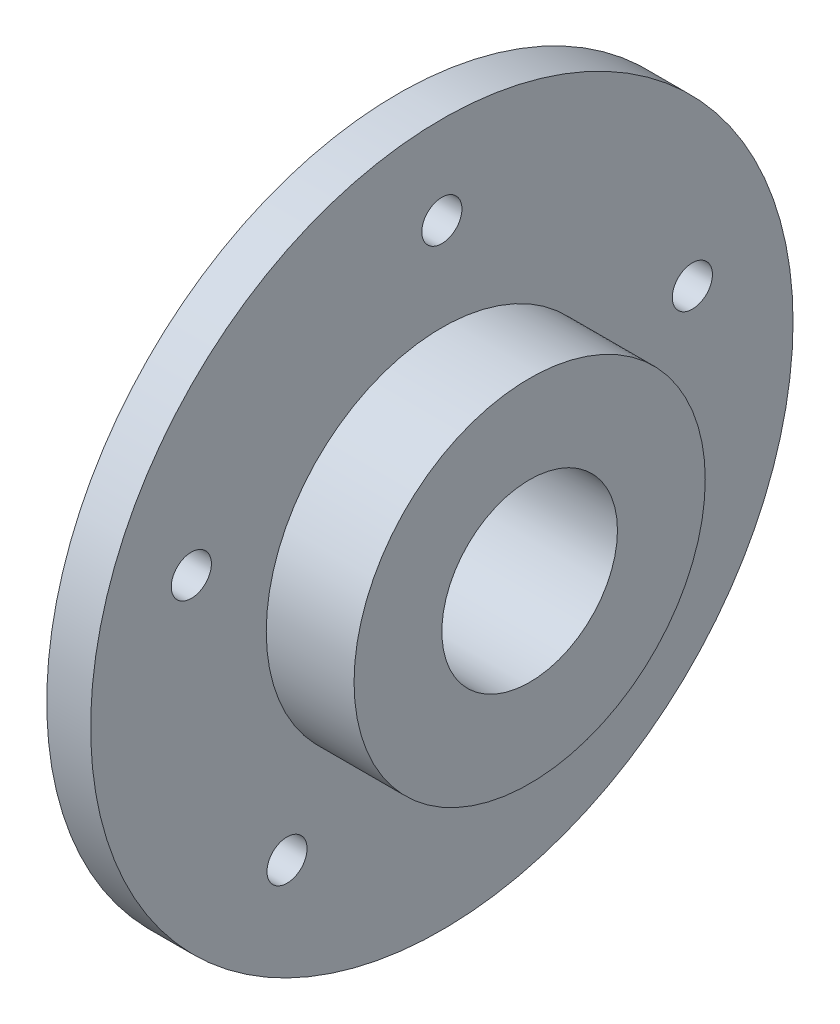
ISO-10303-21;
HEADER;
FILE_DESCRIPTION(('STEP AP214'),'2;1');
FILE_NAME('part.step','',(''),(''),'','','');
FILE_SCHEMA(('AUTOMOTIVE_DESIGN { 1 0 10303 214 1 1 1 1 }'));
ENDSEC;
DATA;
#1=APPLICATION_CONTEXT('core data for automotive mechanical design processes');
#2=APPLICATION_PROTOCOL_DEFINITION('international standard','automotive_design',2000,#1);
#3=PRODUCT_CONTEXT('',#1,'mechanical');
#4=PRODUCT('Part','Part','',(#3));
#5=PRODUCT_RELATED_PRODUCT_CATEGORY('part','',(#4));
#6=PRODUCT_DEFINITION_FORMATION('','',#4);
#7=PRODUCT_DEFINITION_CONTEXT('part definition',#1,'design');
#8=PRODUCT_DEFINITION('design','',#6,#7);
#9=PRODUCT_DEFINITION_SHAPE('','',#8);
#10=(LENGTH_UNIT() NAMED_UNIT(*) SI_UNIT(.MILLI.,.METRE.));
#11=(NAMED_UNIT(*) PLANE_ANGLE_UNIT() SI_UNIT($,.RADIAN.));
#12=(NAMED_UNIT(*) SI_UNIT($,.STERADIAN.) SOLID_ANGLE_UNIT());
#13=UNCERTAINTY_MEASURE_WITH_UNIT(LENGTH_MEASURE(1.E-05),#10,'distance_accuracy_value','');
#14=(GEOMETRIC_REPRESENTATION_CONTEXT(3) GLOBAL_UNCERTAINTY_ASSIGNED_CONTEXT((#13)) GLOBAL_UNIT_ASSIGNED_CONTEXT((#10,
#11,#12)) REPRESENTATION_CONTEXT('',''));
#15=CARTESIAN_POINT('',(0.,0.,0.));
#16=DIRECTION('',(0.,0.,1.));
#17=DIRECTION('',(1.,0.,0.));
#18=AXIS2_PLACEMENT_3D('',#15,#16,#17);
#19=CARTESIAN_POINT('',(6.35,0.711302035018839,0.));
#20=DIRECTION('',(1.,0.,0.));
#21=DIRECTION('',(0.,0.,-1.));
#22=AXIS2_PLACEMENT_3D('',#19,#20,#21);
#23=PLANE('',#22);
#24=CARTESIAN_POINT('',(6.35,0.,0.));
#25=DIRECTION('',(1.,0.,0.));
#26=DIRECTION('',(0.,0.,-1.));
#27=AXIS2_PLACEMENT_3D('',#24,#25,#26);
#28=CIRCLE('',#27,25.4);
#29=CARTESIAN_POINT('',(6.35,0.,-25.4));
#30=VERTEX_POINT('',#29);
#31=EDGE_CURVE('E10',#30,#30,#28,.T.);
#32=ORIENTED_EDGE('',*,*,#31,.F.);
#33=EDGE_LOOP('',(#32));
#34=FACE_BOUND('',#33,.T.);
#35=CARTESIAN_POINT('',(6.35,12.4848495207045,-36.2352532708453));
#36=DIRECTION('',(1.,0.,0.));
#37=DIRECTION('',(0.,0.,-1.));
#38=AXIS2_PLACEMENT_3D('',#35,#36,#37);
#39=CIRCLE('',#38,2.9);
#40=CARTESIAN_POINT('',(6.35,12.4848495207045,-39.1352532708453));
#41=VERTEX_POINT('',#40);
#42=EDGE_CURVE('E65',#41,#41,#39,.T.);
#43=ORIENTED_EDGE('',*,*,#42,.F.);
#44=EDGE_LOOP('',(#43));
#45=FACE_BOUND('',#44,.T.);
#46=CARTESIAN_POINT('',(6.35,-30.1122454506667,22.3946181123432));
#47=DIRECTION('',(1.,0.,0.));
#48=DIRECTION('',(0.,0.,-1.));
#49=AXIS2_PLACEMENT_3D('',#46,#47,#48);
#50=CIRCLE('',#49,2.9);
#51=CARTESIAN_POINT('',(6.35,-30.1122454506667,19.4946181123432));
#52=VERTEX_POINT('',#51);
#53=EDGE_CURVE('E81',#52,#52,#50,.T.);
#54=ORIENTED_EDGE('',*,*,#53,.F.);
#55=EDGE_LOOP('',(#54));
#56=FACE_BOUND('',#55,.T.);
#57=CARTESIAN_POINT('',(6.35,0.711302035018839,0.));
#58=DIRECTION('',(1.,0.,0.));
#59=DIRECTION('',(0.,0.,-1.));
#60=AXIS2_PLACEMENT_3D('',#57,#58,#59);
#61=CIRCLE('',#60,50.8);
#62=CARTESIAN_POINT('',(6.35,0.711302035018839,-50.8));
#63=VERTEX_POINT('',#62);
#64=EDGE_CURVE('E46',#63,#63,#61,.T.);
#65=ORIENTED_EDGE('',*,*,#64,.T.);
#66=EDGE_LOOP('',(#65));
#67=FACE_BOUND('',#66,.T.);
#68=CARTESIAN_POINT('',(6.35,12.4848495207042,36.2352532708454));
#69=DIRECTION('',(1.,0.,0.));
#70=DIRECTION('',(0.,0.,-1.));
#71=AXIS2_PLACEMENT_3D('',#68,#69,#70);
#72=CIRCLE('',#71,2.9);
#73=CARTESIAN_POINT('',(6.35,12.4848495207042,33.3352532708454));
#74=VERTEX_POINT('',#73);
#75=EDGE_CURVE('E89',#74,#74,#72,.T.);
#76=ORIENTED_EDGE('',*,*,#75,.F.);
#77=EDGE_LOOP('',(#76));
#78=FACE_BOUND('',#77,.T.);
#79=CARTESIAN_POINT('',(6.35,-30.1122454506666,-22.3946181123433));
#80=DIRECTION('',(1.,0.,0.));
#81=DIRECTION('',(0.,0.,-1.));
#82=AXIS2_PLACEMENT_3D('',#79,#80,#81);
#83=CIRCLE('',#82,2.9);
#84=CARTESIAN_POINT('',(6.35,-30.1122454506666,-25.2946181123433));
#85=VERTEX_POINT('',#84);
#86=EDGE_CURVE('E73',#85,#85,#83,.T.);
#87=ORIENTED_EDGE('',*,*,#86,.F.);
#88=EDGE_LOOP('',(#87));
#89=FACE_BOUND('',#88,.T.);
#90=CARTESIAN_POINT('',(6.35,38.8113020350188,0.));
#91=DIRECTION('',(1.,0.,0.));
#92=DIRECTION('',(0.,0.,-1.));
#93=AXIS2_PLACEMENT_3D('',#90,#91,#92);
#94=CIRCLE('',#93,2.9);
#95=CARTESIAN_POINT('',(6.35,38.8113020350188,-2.9));
#96=VERTEX_POINT('',#95);
#97=EDGE_CURVE('E56',#96,#96,#94,.T.);
#98=ORIENTED_EDGE('',*,*,#97,.F.);
#99=EDGE_LOOP('',(#98));
#100=FACE_BOUND('',#99,.T.);
#101=ADVANCED_FACE('F37',(#34,#45,#56,#67,#78,#89,#100),#23,.T.);
#102=CARTESIAN_POINT('',(0.,0.711302035018839,0.));
#103=DIRECTION('',(1.,0.,0.));
#104=DIRECTION('',(0.,0.,-1.));
#105=AXIS2_PLACEMENT_3D('',#102,#103,#104);
#106=PLANE('',#105);
#107=CARTESIAN_POINT('',(0.,0.,0.));
#108=DIRECTION('',(1.,0.,0.));
#109=DIRECTION('',(0.,0.,-1.));
#110=AXIS2_PLACEMENT_3D('',#107,#108,#109);
#111=CIRCLE('',#110,12.7);
#112=CARTESIAN_POINT('',(0.,0.,-12.7));
#113=VERTEX_POINT('',#112);
#114=EDGE_CURVE('E214',#113,#113,#111,.F.);
#115=ORIENTED_EDGE('',*,*,#114,.F.);
#116=EDGE_LOOP('',(#115));
#117=FACE_BOUND('',#116,.T.);
#118=CARTESIAN_POINT('',(0.,0.711302035018839,0.));
#119=DIRECTION('',(1.,0.,0.));
#120=DIRECTION('',(0.,0.,-1.));
#121=AXIS2_PLACEMENT_3D('',#118,#119,#120);
#122=CIRCLE('',#121,50.8);
#123=CARTESIAN_POINT('',(0.,0.711302035018839,-50.8));
#124=VERTEX_POINT('',#123);
#125=EDGE_CURVE('E41',#124,#124,#122,.T.);
#126=ORIENTED_EDGE('',*,*,#125,.F.);
#127=EDGE_LOOP('',(#126));
#128=FACE_BOUND('',#127,.T.);
#129=CARTESIAN_POINT('',(0.,12.4848495207042,36.2352532708454));
#130=DIRECTION('',(1.,0.,0.));
#131=DIRECTION('',(0.,0.,-1.));
#132=AXIS2_PLACEMENT_3D('',#129,#130,#131);
#133=CIRCLE('',#132,2.9);
#134=CARTESIAN_POINT('',(0.,12.4848495207042,33.3352532708454));
#135=VERTEX_POINT('',#134);
#136=EDGE_CURVE('E85',#135,#135,#133,.T.);
#137=ORIENTED_EDGE('',*,*,#136,.T.);
#138=EDGE_LOOP('',(#137));
#139=FACE_BOUND('',#138,.T.);
#140=CARTESIAN_POINT('',(0.,-30.1122454506667,22.3946181123432));
#141=DIRECTION('',(1.,0.,0.));
#142=DIRECTION('',(0.,0.,-1.));
#143=AXIS2_PLACEMENT_3D('',#140,#141,#142);
#144=CIRCLE('',#143,2.9);
#145=CARTESIAN_POINT('',(0.,-30.1122454506667,19.4946181123432));
#146=VERTEX_POINT('',#145);
#147=EDGE_CURVE('E77',#146,#146,#144,.T.);
#148=ORIENTED_EDGE('',*,*,#147,.T.);
#149=EDGE_LOOP('',(#148));
#150=FACE_BOUND('',#149,.T.);
#151=CARTESIAN_POINT('',(0.,-30.1122454506666,-22.3946181123433));
#152=DIRECTION('',(1.,0.,0.));
#153=DIRECTION('',(0.,0.,-1.));
#154=AXIS2_PLACEMENT_3D('',#151,#152,#153);
#155=CIRCLE('',#154,2.9);
#156=CARTESIAN_POINT('',(0.,-30.1122454506666,-25.2946181123433));
#157=VERTEX_POINT('',#156);
#158=EDGE_CURVE('E69',#157,#157,#155,.T.);
#159=ORIENTED_EDGE('',*,*,#158,.T.);
#160=EDGE_LOOP('',(#159));
#161=FACE_BOUND('',#160,.T.);
#162=CARTESIAN_POINT('',(0.,12.4848495207045,-36.2352532708453));
#163=DIRECTION('',(1.,0.,0.));
#164=DIRECTION('',(0.,0.,-1.));
#165=AXIS2_PLACEMENT_3D('',#162,#163,#164);
#166=CIRCLE('',#165,2.9);
#167=CARTESIAN_POINT('',(0.,12.4848495207045,-39.1352532708453));
#168=VERTEX_POINT('',#167);
#169=EDGE_CURVE('E60',#168,#168,#166,.T.);
#170=ORIENTED_EDGE('',*,*,#169,.T.);
#171=EDGE_LOOP('',(#170));
#172=FACE_BOUND('',#171,.T.);
#173=CARTESIAN_POINT('',(0.,38.8113020350188,0.));
#174=DIRECTION('',(1.,0.,0.));
#175=DIRECTION('',(0.,0.,-1.));
#176=AXIS2_PLACEMENT_3D('',#173,#174,#175);
#177=CIRCLE('',#176,2.9);
#178=CARTESIAN_POINT('',(0.,38.8113020350188,-2.9));
#179=VERTEX_POINT('',#178);
#180=EDGE_CURVE('E61',#179,#179,#177,.T.);
#181=ORIENTED_EDGE('',*,*,#180,.T.);
#182=EDGE_LOOP('',(#181));
#183=FACE_BOUND('',#182,.T.);
#184=ADVANCED_FACE('F97',(#117,#128,#139,#150,#161,#172,#183),#106,.F.);
#185=CARTESIAN_POINT('',(6.35,0.711302035018839,0.));
#186=DIRECTION('',(-1.,0.,0.));
#187=DIRECTION('',(0.,0.,1.));
#188=AXIS2_PLACEMENT_3D('',#185,#186,#187);
#189=CYLINDRICAL_SURFACE('',#188,50.8);
#190=ORIENTED_EDGE('',*,*,#64,.F.);
#191=EDGE_LOOP('',(#190));
#192=FACE_BOUND('',#191,.T.);
#193=ORIENTED_EDGE('',*,*,#125,.T.);
#194=EDGE_LOOP('',(#193));
#195=FACE_BOUND('',#194,.T.);
#196=ADVANCED_FACE('F39',(#192,#195),#189,.T.);
#197=CARTESIAN_POINT('',(6.35,12.4848495207042,36.2352532708454));
#198=DIRECTION('',(-1.,0.,0.));
#199=DIRECTION('',(0.,0.,1.));
#200=AXIS2_PLACEMENT_3D('',#197,#198,#199);
#201=CYLINDRICAL_SURFACE('',#200,2.9);
#202=ORIENTED_EDGE('',*,*,#75,.T.);
#203=EDGE_LOOP('',(#202));
#204=FACE_BOUND('',#203,.T.);
#205=ORIENTED_EDGE('',*,*,#136,.F.);
#206=EDGE_LOOP('',(#205));
#207=FACE_BOUND('',#206,.T.);
#208=ADVANCED_FACE('F100',(#204,#207),#201,.F.);
#209=CARTESIAN_POINT('',(6.35,-30.1122454506667,22.3946181123432));
#210=DIRECTION('',(-1.,0.,0.));
#211=DIRECTION('',(0.,0.,1.));
#212=AXIS2_PLACEMENT_3D('',#209,#210,#211);
#213=CYLINDRICAL_SURFACE('',#212,2.9);
#214=ORIENTED_EDGE('',*,*,#53,.T.);
#215=EDGE_LOOP('',(#214));
#216=FACE_BOUND('',#215,.T.);
#217=ORIENTED_EDGE('',*,*,#147,.F.);
#218=EDGE_LOOP('',(#217));
#219=FACE_BOUND('',#218,.T.);
#220=ADVANCED_FACE('F102',(#216,#219),#213,.F.);
#221=CARTESIAN_POINT('',(6.35,-30.1122454506666,-22.3946181123433));
#222=DIRECTION('',(-1.,0.,0.));
#223=DIRECTION('',(0.,0.,1.));
#224=AXIS2_PLACEMENT_3D('',#221,#222,#223);
#225=CYLINDRICAL_SURFACE('',#224,2.9);
#226=ORIENTED_EDGE('',*,*,#86,.T.);
#227=EDGE_LOOP('',(#226));
#228=FACE_BOUND('',#227,.T.);
#229=ORIENTED_EDGE('',*,*,#158,.F.);
#230=EDGE_LOOP('',(#229));
#231=FACE_BOUND('',#230,.T.);
#232=ADVANCED_FACE('F109',(#228,#231),#225,.F.);
#233=CARTESIAN_POINT('',(6.35,12.4848495207045,-36.2352532708453));
#234=DIRECTION('',(-1.,0.,0.));
#235=DIRECTION('',(0.,0.,1.));
#236=AXIS2_PLACEMENT_3D('',#233,#234,#235);
#237=CYLINDRICAL_SURFACE('',#236,2.9);
#238=ORIENTED_EDGE('',*,*,#42,.T.);
#239=EDGE_LOOP('',(#238));
#240=FACE_BOUND('',#239,.T.);
#241=ORIENTED_EDGE('',*,*,#169,.F.);
#242=EDGE_LOOP('',(#241));
#243=FACE_BOUND('',#242,.T.);
#244=ADVANCED_FACE('F137',(#240,#243),#237,.F.);
#245=CARTESIAN_POINT('',(6.35,38.8113020350188,0.));
#246=DIRECTION('',(-1.,0.,0.));
#247=DIRECTION('',(0.,0.,1.));
#248=AXIS2_PLACEMENT_3D('',#245,#246,#247);
#249=CYLINDRICAL_SURFACE('',#248,2.9);
#250=ORIENTED_EDGE('',*,*,#97,.T.);
#251=EDGE_LOOP('',(#250));
#252=FACE_BOUND('',#251,.T.);
#253=ORIENTED_EDGE('',*,*,#180,.F.);
#254=EDGE_LOOP('',(#253));
#255=FACE_BOUND('',#254,.T.);
#256=ADVANCED_FACE('F133',(#252,#255),#249,.F.);
#257=CARTESIAN_POINT('',(19.05,0.,0.));
#258=DIRECTION('',(-1.,0.,0.));
#259=DIRECTION('',(0.,0.,1.));
#260=AXIS2_PLACEMENT_3D('',#257,#258,#259);
#261=CYLINDRICAL_SURFACE('',#260,25.4);
#262=CARTESIAN_POINT('',(19.05,0.,0.));
#263=DIRECTION('',(1.,0.,0.));
#264=DIRECTION('',(0.,0.,-1.));
#265=AXIS2_PLACEMENT_3D('',#262,#263,#264);
#266=CIRCLE('',#265,25.4);
#267=CARTESIAN_POINT('',(19.05,0.,-25.4));
#268=VERTEX_POINT('',#267);
#269=EDGE_CURVE('E54',#268,#268,#266,.T.);
#270=ORIENTED_EDGE('',*,*,#269,.F.);
#271=EDGE_LOOP('',(#270));
#272=FACE_BOUND('',#271,.T.);
#273=ORIENTED_EDGE('',*,*,#31,.T.);
#274=EDGE_LOOP('',(#273));
#275=FACE_BOUND('',#274,.T.);
#276=ADVANCED_FACE('F136',(#272,#275),#261,.T.);
#277=CARTESIAN_POINT('',(19.05,0.,0.));
#278=DIRECTION('',(1.,0.,0.));
#279=DIRECTION('',(0.,0.,-1.));
#280=AXIS2_PLACEMENT_3D('',#277,#278,#279);
#281=PLANE('',#280);
#282=CARTESIAN_POINT('',(19.05,0.,0.));
#283=DIRECTION('',(1.,0.,0.));
#284=DIRECTION('',(0.,0.,-1.));
#285=AXIS2_PLACEMENT_3D('',#282,#283,#284);
#286=CIRCLE('',#285,12.7);
#287=CARTESIAN_POINT('',(19.05,0.,-12.7));
#288=VERTEX_POINT('',#287);
#289=EDGE_CURVE('E217',#288,#288,#286,.T.);
#290=ORIENTED_EDGE('',*,*,#289,.F.);
#291=EDGE_LOOP('',(#290));
#292=FACE_BOUND('',#291,.T.);
#293=ORIENTED_EDGE('',*,*,#269,.T.);
#294=EDGE_LOOP('',(#293));
#295=FACE_BOUND('',#294,.T.);
#296=ADVANCED_FACE('F145',(#292,#295),#281,.T.);
#297=CARTESIAN_POINT('',(-35.9210244842766,0.,0.));
#298=DIRECTION('',(1.,0.,0.));
#299=DIRECTION('',(0.,0.,-1.));
#300=AXIS2_PLACEMENT_3D('',#297,#298,#299);
#301=CYLINDRICAL_SURFACE('',#300,12.7);
#302=ORIENTED_EDGE('',*,*,#114,.T.);
#303=EDGE_LOOP('',(#302));
#304=FACE_BOUND('',#303,.T.);
#305=ORIENTED_EDGE('',*,*,#289,.T.);
#306=EDGE_LOOP('',(#305));
#307=FACE_BOUND('',#306,.T.);
#308=ADVANCED_FACE('F198',(#304,#307),#301,.F.);
#309=CLOSED_SHELL('',(#101,#184,#196,#208,#220,#232,#244,#256,#276,#296,#308));
#310=MANIFOLD_SOLID_BREP('B2',#309);
#311=ADVANCED_BREP_SHAPE_REPRESENTATION('',(#18,#310),#14);
#312=SHAPE_DEFINITION_REPRESENTATION(#9,#311);
ENDSEC;
END-ISO-10303-21;
